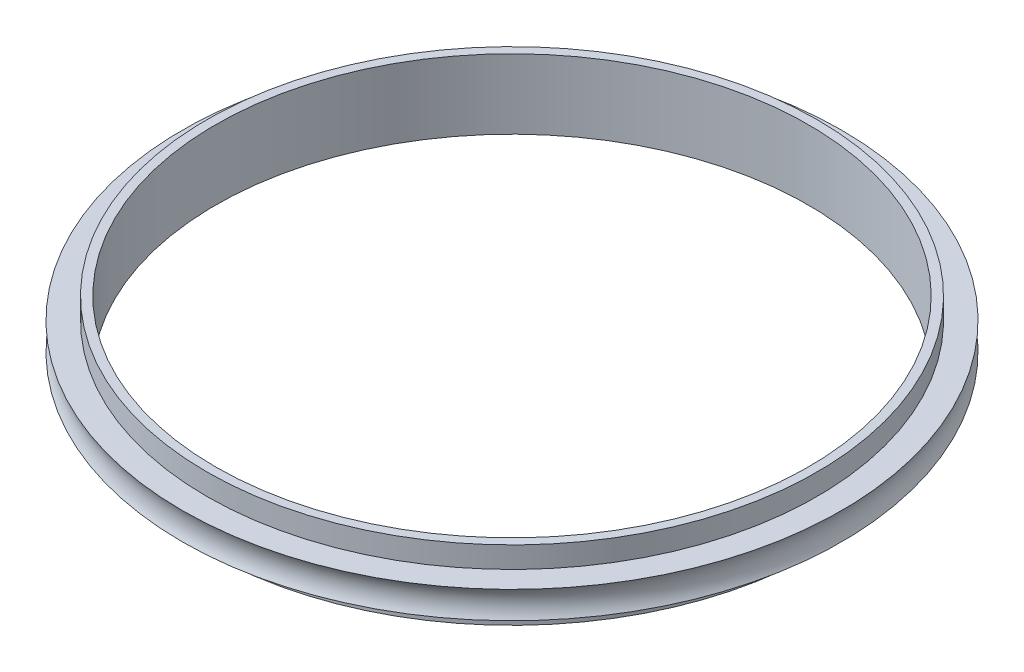
ISO-10303-21;
HEADER;
FILE_DESCRIPTION(('STEP AP214'),'2;1');
FILE_NAME('part.step','',(''),(''),'','','');
FILE_SCHEMA(('AUTOMOTIVE_DESIGN { 1 0 10303 214 1 1 1 1 }'));
ENDSEC;
DATA;
#1=APPLICATION_CONTEXT('core data for automotive mechanical design processes');
#2=APPLICATION_PROTOCOL_DEFINITION('international standard','automotive_design',2000,#1);
#3=PRODUCT_CONTEXT('',#1,'mechanical');
#4=PRODUCT('Part','Part','',(#3));
#5=PRODUCT_RELATED_PRODUCT_CATEGORY('part','',(#4));
#6=PRODUCT_DEFINITION_FORMATION('','',#4);
#7=PRODUCT_DEFINITION_CONTEXT('part definition',#1,'design');
#8=PRODUCT_DEFINITION('design','',#6,#7);
#9=PRODUCT_DEFINITION_SHAPE('','',#8);
#10=(LENGTH_UNIT() NAMED_UNIT(*) SI_UNIT(.MILLI.,.METRE.));
#11=(NAMED_UNIT(*) PLANE_ANGLE_UNIT() SI_UNIT($,.RADIAN.));
#12=(NAMED_UNIT(*) SI_UNIT($,.STERADIAN.) SOLID_ANGLE_UNIT());
#13=UNCERTAINTY_MEASURE_WITH_UNIT(LENGTH_MEASURE(1.E-05),#10,'distance_accuracy_value','');
#14=(GEOMETRIC_REPRESENTATION_CONTEXT(3) GLOBAL_UNCERTAINTY_ASSIGNED_CONTEXT((#13)) GLOBAL_UNIT_ASSIGNED_CONTEXT((#10,
#11,#12)) REPRESENTATION_CONTEXT('',''));
#15=CARTESIAN_POINT('',(0.,0.,0.));
#16=DIRECTION('',(0.,0.,1.));
#17=DIRECTION('',(1.,0.,0.));
#18=AXIS2_PLACEMENT_3D('',#15,#16,#17);
#19=CARTESIAN_POINT('',(0.,0.,0.));
#20=DIRECTION('',(0.,1.,0.));
#21=DIRECTION('',(1.,0.,0.));
#22=AXIS2_PLACEMENT_3D('',#19,#20,#21);
#23=TOROIDAL_SURFACE('',#22,40.38870434966,3.02);
#24=CARTESIAN_POINT('',(0.,1.555316620513,0.));
#25=DIRECTION('',(0.,1.,0.));
#26=DIRECTION('',(0.,0.,1.));
#27=AXIS2_PLACEMENT_3D('',#24,#25,#26);
#28=CIRCLE('',#27,37.7999999999986);
#29=CARTESIAN_POINT('',(0.,1.555316620513,37.7999999999986));
#30=VERTEX_POINT('',#29);
#31=EDGE_CURVE('E42',#30,#30,#28,.T.);
#32=ORIENTED_EDGE('',*,*,#31,.F.);
#33=EDGE_LOOP('',(#32));
#34=FACE_BOUND('',#33,.T.);
#35=CARTESIAN_POINT('',(0.,-1.555316620513,0.));
#36=DIRECTION('',(0.,1.,0.));
#37=DIRECTION('',(0.,0.,1.));
#38=AXIS2_PLACEMENT_3D('',#35,#36,#37);
#39=CIRCLE('',#38,37.7999999999986);
#40=CARTESIAN_POINT('',(0.,-1.555316620513,37.7999999999986));
#41=VERTEX_POINT('',#40);
#42=EDGE_CURVE('E19',#41,#41,#39,.T.);
#43=ORIENTED_EDGE('',*,*,#42,.T.);
#44=EDGE_LOOP('',(#43));
#45=FACE_BOUND('',#44,.T.);
#46=ADVANCED_FACE('F15',(#34,#45),#23,.F.);
#47=CARTESIAN_POINT('',(0.,-1.555316620513,0.));
#48=DIRECTION('',(0.,1.,0.));
#49=DIRECTION('',(0.,0.,1.));
#50=AXIS2_PLACEMENT_3D('',#47,#48,#49);
#51=PLANE('',#50);
#52=CARTESIAN_POINT('',(0.,-1.555316620513,0.));
#53=DIRECTION('',(0.,1.,0.));
#54=DIRECTION('',(0.,0.,1.));
#55=AXIS2_PLACEMENT_3D('',#52,#53,#54);
#56=CIRCLE('',#55,35.);
#57=CARTESIAN_POINT('',(0.,-1.555316620513,35.));
#58=VERTEX_POINT('',#57);
#59=EDGE_CURVE('E40',#58,#58,#56,.F.);
#60=ORIENTED_EDGE('',*,*,#59,.F.);
#61=EDGE_LOOP('',(#60));
#62=FACE_BOUND('',#61,.T.);
#63=ORIENTED_EDGE('',*,*,#42,.F.);
#64=EDGE_LOOP('',(#63));
#65=FACE_BOUND('',#64,.T.);
#66=ADVANCED_FACE('F50',(#62,#65),#51,.F.);
#67=CARTESIAN_POINT('',(0.,1.555316620513,0.));
#68=DIRECTION('',(0.,1.,0.));
#69=DIRECTION('',(0.,0.,1.));
#70=AXIS2_PLACEMENT_3D('',#67,#68,#69);
#71=PLANE('',#70);
#72=CARTESIAN_POINT('',(0.,1.555316620513,0.));
#73=DIRECTION('',(0.,1.,0.));
#74=DIRECTION('',(0.,0.,1.));
#75=AXIS2_PLACEMENT_3D('',#72,#73,#74);
#76=CIRCLE('',#75,35.);
#77=CARTESIAN_POINT('',(0.,1.555316620513,35.));
#78=VERTEX_POINT('',#77);
#79=EDGE_CURVE('E37',#78,#78,#76,.T.);
#80=ORIENTED_EDGE('',*,*,#79,.F.);
#81=EDGE_LOOP('',(#80));
#82=FACE_BOUND('',#81,.T.);
#83=ORIENTED_EDGE('',*,*,#31,.T.);
#84=EDGE_LOOP('',(#83));
#85=FACE_BOUND('',#84,.T.);
#86=ADVANCED_FACE('F52',(#82,#85),#71,.T.);
#87=CARTESIAN_POINT('',(0.,-4.394848282565,0.));
#88=DIRECTION('',(0.,1.,0.));
#89=DIRECTION('',(0.,0.,1.));
#90=AXIS2_PLACEMENT_3D('',#87,#88,#89);
#91=CYLINDRICAL_SURFACE('',#90,35.);
#92=ORIENTED_EDGE('',*,*,#59,.T.);
#93=EDGE_LOOP('',(#92));
#94=FACE_BOUND('',#93,.T.);
#95=CARTESIAN_POINT('',(0.,-3.995316620513,0.));
#96=DIRECTION('',(0.,1.,0.));
#97=DIRECTION('',(0.,0.,1.));
#98=AXIS2_PLACEMENT_3D('',#95,#96,#97);
#99=CIRCLE('',#98,35.);
#100=CARTESIAN_POINT('',(0.,-3.995316620513,35.));
#101=VERTEX_POINT('',#100);
#102=EDGE_CURVE('E34',#101,#101,#99,.T.);
#103=ORIENTED_EDGE('',*,*,#102,.T.);
#104=EDGE_LOOP('',(#103));
#105=FACE_BOUND('',#104,.T.);
#106=ADVANCED_FACE('F59',(#94,#105),#91,.T.);
#107=CARTESIAN_POINT('',(0.,-4.394848282565,0.));
#108=DIRECTION('',(0.,1.,0.));
#109=DIRECTION('',(0.,0.,1.));
#110=AXIS2_PLACEMENT_3D('',#107,#108,#109);
#111=CYLINDRICAL_SURFACE('',#110,35.);
#112=CARTESIAN_POINT('',(0.,3.995316620513,0.));
#113=DIRECTION('',(0.,1.,0.));
#114=DIRECTION('',(0.,0.,1.));
#115=AXIS2_PLACEMENT_3D('',#112,#113,#114);
#116=CIRCLE('',#115,35.);
#117=CARTESIAN_POINT('',(0.,3.995316620513,35.));
#118=VERTEX_POINT('',#117);
#119=EDGE_CURVE('E28',#118,#118,#116,.T.);
#120=ORIENTED_EDGE('',*,*,#119,.F.);
#121=EDGE_LOOP('',(#120));
#122=FACE_BOUND('',#121,.T.);
#123=ORIENTED_EDGE('',*,*,#79,.T.);
#124=EDGE_LOOP('',(#123));
#125=FACE_BOUND('',#124,.T.);
#126=ADVANCED_FACE('F79',(#122,#125),#111,.T.);
#127=CARTESIAN_POINT('',(0.,-3.995316620513,0.));
#128=DIRECTION('',(0.,1.,0.));
#129=DIRECTION('',(0.,0.,1.));
#130=AXIS2_PLACEMENT_3D('',#127,#128,#129);
#131=PLANE('',#130);
#132=CARTESIAN_POINT('',(0.,-3.995316620513,0.));
#133=DIRECTION('',(0.,1.,0.));
#134=DIRECTION('',(0.,0.,1.));
#135=AXIS2_PLACEMENT_3D('',#132,#133,#134);
#136=CIRCLE('',#135,34.);
#137=CARTESIAN_POINT('',(0.,-3.995316620513,34.));
#138=VERTEX_POINT('',#137);
#139=EDGE_CURVE('E23',#138,#138,#136,.T.);
#140=ORIENTED_EDGE('',*,*,#139,.T.);
#141=EDGE_LOOP('',(#140));
#142=FACE_BOUND('',#141,.T.);
#143=ORIENTED_EDGE('',*,*,#102,.F.);
#144=EDGE_LOOP('',(#143));
#145=FACE_BOUND('',#144,.T.);
#146=ADVANCED_FACE('F72',(#142,#145),#131,.F.);
#147=CARTESIAN_POINT('',(0.,3.995316620513,0.));
#148=DIRECTION('',(0.,1.,0.));
#149=DIRECTION('',(0.,0.,1.));
#150=AXIS2_PLACEMENT_3D('',#147,#148,#149);
#151=PLANE('',#150);
#152=CARTESIAN_POINT('',(0.,3.995316620513,0.));
#153=DIRECTION('',(0.,1.,0.));
#154=DIRECTION('',(0.,0.,1.));
#155=AXIS2_PLACEMENT_3D('',#152,#153,#154);
#156=CIRCLE('',#155,34.);
#157=CARTESIAN_POINT('',(0.,3.995316620513,34.));
#158=VERTEX_POINT('',#157);
#159=EDGE_CURVE('E10',#158,#158,#156,.F.);
#160=ORIENTED_EDGE('',*,*,#159,.T.);
#161=EDGE_LOOP('',(#160));
#162=FACE_BOUND('',#161,.T.);
#163=ORIENTED_EDGE('',*,*,#119,.T.);
#164=EDGE_LOOP('',(#163));
#165=FACE_BOUND('',#164,.T.);
#166=ADVANCED_FACE('F66',(#162,#165),#151,.T.);
#167=CARTESIAN_POINT('',(0.,-4.394848282565,0.));
#168=DIRECTION('',(0.,1.,0.));
#169=DIRECTION('',(0.,0.,1.));
#170=AXIS2_PLACEMENT_3D('',#167,#168,#169);
#171=CYLINDRICAL_SURFACE('',#170,34.);
#172=ORIENTED_EDGE('',*,*,#139,.F.);
#173=EDGE_LOOP('',(#172));
#174=FACE_BOUND('',#173,.T.);
#175=ORIENTED_EDGE('',*,*,#159,.F.);
#176=EDGE_LOOP('',(#175));
#177=FACE_BOUND('',#176,.T.);
#178=ADVANCED_FACE('F64',(#174,#177),#171,.F.);
#179=CLOSED_SHELL('',(#46,#66,#86,#106,#126,#146,#166,#178));
#180=MANIFOLD_SOLID_BREP('B1',#179);
#181=ADVANCED_BREP_SHAPE_REPRESENTATION('',(#18,#180),#14);
#182=SHAPE_DEFINITION_REPRESENTATION(#9,#181);
ENDSEC;
END-ISO-10303-21;
